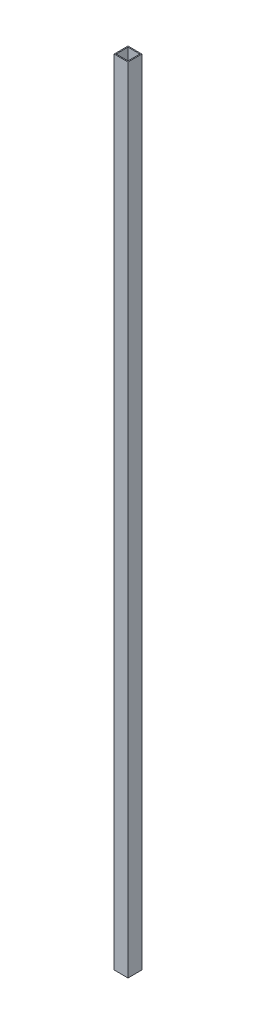
ISO-10303-21;
HEADER;
FILE_DESCRIPTION(('STEP AP214'),'2;1');
FILE_NAME('part.step','',(''),(''),'','','');
FILE_SCHEMA(('AUTOMOTIVE_DESIGN { 1 0 10303 214 1 1 1 1 }'));
ENDSEC;
DATA;
#1=APPLICATION_CONTEXT('core data for automotive mechanical design processes');
#2=APPLICATION_PROTOCOL_DEFINITION('international standard','automotive_design',2000,#1);
#3=PRODUCT_CONTEXT('',#1,'mechanical');
#4=PRODUCT('Part','Part','',(#3));
#5=PRODUCT_RELATED_PRODUCT_CATEGORY('part','',(#4));
#6=PRODUCT_DEFINITION_FORMATION('','',#4);
#7=PRODUCT_DEFINITION_CONTEXT('part definition',#1,'design');
#8=PRODUCT_DEFINITION('design','',#6,#7);
#9=PRODUCT_DEFINITION_SHAPE('','',#8);
#10=(LENGTH_UNIT() NAMED_UNIT(*) SI_UNIT(.MILLI.,.METRE.));
#11=(NAMED_UNIT(*) PLANE_ANGLE_UNIT() SI_UNIT($,.RADIAN.));
#12=(NAMED_UNIT(*) SI_UNIT($,.STERADIAN.) SOLID_ANGLE_UNIT());
#13=UNCERTAINTY_MEASURE_WITH_UNIT(LENGTH_MEASURE(1.E-05),#10,'distance_accuracy_value','');
#14=(GEOMETRIC_REPRESENTATION_CONTEXT(3) GLOBAL_UNCERTAINTY_ASSIGNED_CONTEXT((#13)) GLOBAL_UNIT_ASSIGNED_CONTEXT((#10,
#11,#12)) REPRESENTATION_CONTEXT('',''));
#15=CARTESIAN_POINT('',(0.,0.,0.));
#16=DIRECTION('',(0.,0.,1.));
#17=DIRECTION('',(1.,0.,0.));
#18=AXIS2_PLACEMENT_3D('',#15,#16,#17);
#19=CARTESIAN_POINT('',(0.,800.,0.));
#20=DIRECTION('',(0.,1.,0.));
#21=DIRECTION('',(0.,0.,1.));
#22=AXIS2_PLACEMENT_3D('',#19,#20,#21);
#23=PLANE('',#22);
#24=DIRECTION('',(-1.,0.,0.));
#25=VECTOR('',#24,1.);
#26=CARTESIAN_POINT('',(0.,800.,0.));
#27=LINE('',#26,#25);
#28=CARTESIAN_POINT('',(0.,800.,0.));
#29=VERTEX_POINT('',#28);
#30=CARTESIAN_POINT('',(-14.,800.,0.));
#31=VERTEX_POINT('',#30);
#32=EDGE_CURVE('E157',#29,#31,#27,.T.);
#33=ORIENTED_EDGE('',*,*,#32,.T.);
#34=DIRECTION('',(0.,0.,1.));
#35=VECTOR('',#34,1.);
#36=CARTESIAN_POINT('',(-14.,800.,0.));
#37=LINE('',#36,#35);
#38=CARTESIAN_POINT('',(-14.,800.,14.));
#39=VERTEX_POINT('',#38);
#40=EDGE_CURVE('E160',#31,#39,#37,.T.);
#41=ORIENTED_EDGE('',*,*,#40,.T.);
#42=DIRECTION('',(-1.,0.,0.));
#43=VECTOR('',#42,1.);
#44=CARTESIAN_POINT('',(0.,800.,14.));
#45=LINE('',#44,#43);
#46=CARTESIAN_POINT('',(0.,800.,14.));
#47=VERTEX_POINT('',#46);
#48=EDGE_CURVE('E163',#47,#39,#45,.T.);
#49=ORIENTED_EDGE('',*,*,#48,.F.);
#50=DIRECTION('',(0.,0.,1.));
#51=VECTOR('',#50,1.);
#52=CARTESIAN_POINT('',(0.,800.,0.));
#53=LINE('',#52,#51);
#54=EDGE_CURVE('E166',#29,#47,#53,.T.);
#55=ORIENTED_EDGE('',*,*,#54,.F.);
#56=EDGE_LOOP('',(#33,#41,#49,#55));
#57=FACE_BOUND('',#56,.T.);
#58=DIRECTION('',(0.,0.,1.));
#59=VECTOR('',#58,1.);
#60=CARTESIAN_POINT('',(-13.,800.,1.));
#61=LINE('',#60,#59);
#62=CARTESIAN_POINT('',(-13.,800.,1.));
#63=VERTEX_POINT('',#62);
#64=CARTESIAN_POINT('',(-13.,800.,13.));
#65=VERTEX_POINT('',#64);
#66=EDGE_CURVE('E131',#63,#65,#61,.T.);
#67=ORIENTED_EDGE('',*,*,#66,.F.);
#68=DIRECTION('',(-1.,0.,0.));
#69=VECTOR('',#68,1.);
#70=CARTESIAN_POINT('',(-1.,800.,1.));
#71=LINE('',#70,#69);
#72=CARTESIAN_POINT('',(-1.,800.,1.));
#73=VERTEX_POINT('',#72);
#74=EDGE_CURVE('E122',#73,#63,#71,.T.);
#75=ORIENTED_EDGE('',*,*,#74,.F.);
#76=DIRECTION('',(0.,0.,1.));
#77=VECTOR('',#76,1.);
#78=CARTESIAN_POINT('',(-1.,800.,1.));
#79=LINE('',#78,#77);
#80=CARTESIAN_POINT('',(-1.,800.,13.));
#81=VERTEX_POINT('',#80);
#82=EDGE_CURVE('E142',#73,#81,#79,.T.);
#83=ORIENTED_EDGE('',*,*,#82,.T.);
#84=DIRECTION('',(-1.,0.,0.));
#85=VECTOR('',#84,1.);
#86=CARTESIAN_POINT('',(-1.,800.,13.));
#87=LINE('',#86,#85);
#88=EDGE_CURVE('E72',#81,#65,#87,.T.);
#89=ORIENTED_EDGE('',*,*,#88,.T.);
#90=EDGE_LOOP('',(#67,#75,#83,#89));
#91=FACE_BOUND('',#90,.T.);
#92=ADVANCED_FACE('F57',(#57,#91),#23,.T.);
#93=CARTESIAN_POINT('',(0.,0.,0.));
#94=DIRECTION('',(0.,1.,0.));
#95=DIRECTION('',(0.,0.,1.));
#96=AXIS2_PLACEMENT_3D('',#93,#94,#95);
#97=PLANE('',#96);
#98=DIRECTION('',(-1.,0.,0.));
#99=VECTOR('',#98,1.);
#100=CARTESIAN_POINT('',(0.,0.,0.));
#101=LINE('',#100,#99);
#102=CARTESIAN_POINT('',(0.,0.,0.));
#103=VERTEX_POINT('',#102);
#104=CARTESIAN_POINT('',(-14.,0.,0.));
#105=VERTEX_POINT('',#104);
#106=EDGE_CURVE('E138',#103,#105,#101,.T.);
#107=ORIENTED_EDGE('',*,*,#106,.F.);
#108=DIRECTION('',(0.,0.,1.));
#109=VECTOR('',#108,1.);
#110=CARTESIAN_POINT('',(0.,0.,0.));
#111=LINE('',#110,#109);
#112=CARTESIAN_POINT('',(0.,0.,14.));
#113=VERTEX_POINT('',#112);
#114=EDGE_CURVE('E161',#103,#113,#111,.T.);
#115=ORIENTED_EDGE('',*,*,#114,.T.);
#116=DIRECTION('',(-1.,0.,0.));
#117=VECTOR('',#116,1.);
#118=CARTESIAN_POINT('',(0.,0.,14.));
#119=LINE('',#118,#117);
#120=CARTESIAN_POINT('',(-14.,0.,14.));
#121=VERTEX_POINT('',#120);
#122=EDGE_CURVE('E175',#113,#121,#119,.T.);
#123=ORIENTED_EDGE('',*,*,#122,.T.);
#124=DIRECTION('',(0.,0.,1.));
#125=VECTOR('',#124,1.);
#126=CARTESIAN_POINT('',(-14.,0.,0.));
#127=LINE('',#126,#125);
#128=EDGE_CURVE('E172',#105,#121,#127,.T.);
#129=ORIENTED_EDGE('',*,*,#128,.F.);
#130=EDGE_LOOP('',(#107,#115,#123,#129));
#131=FACE_BOUND('',#130,.T.);
#132=DIRECTION('',(-1.,0.,0.));
#133=VECTOR('',#132,1.);
#134=CARTESIAN_POINT('',(-1.,0.,1.));
#135=LINE('',#134,#133);
#136=CARTESIAN_POINT('',(-1.,0.,1.));
#137=VERTEX_POINT('',#136);
#138=CARTESIAN_POINT('',(-13.,0.,1.));
#139=VERTEX_POINT('',#138);
#140=EDGE_CURVE('E80',#137,#139,#135,.T.);
#141=ORIENTED_EDGE('',*,*,#140,.T.);
#142=DIRECTION('',(0.,0.,1.));
#143=VECTOR('',#142,1.);
#144=CARTESIAN_POINT('',(-13.,0.,1.));
#145=LINE('',#144,#143);
#146=CARTESIAN_POINT('',(-13.,0.,13.));
#147=VERTEX_POINT('',#146);
#148=EDGE_CURVE('E137',#139,#147,#145,.T.);
#149=ORIENTED_EDGE('',*,*,#148,.T.);
#150=DIRECTION('',(-1.,0.,0.));
#151=VECTOR('',#150,1.);
#152=CARTESIAN_POINT('',(-1.,0.,13.));
#153=LINE('',#152,#151);
#154=CARTESIAN_POINT('',(-1.,0.,13.));
#155=VERTEX_POINT('',#154);
#156=EDGE_CURVE('E148',#155,#147,#153,.T.);
#157=ORIENTED_EDGE('',*,*,#156,.F.);
#158=DIRECTION('',(0.,0.,1.));
#159=VECTOR('',#158,1.);
#160=CARTESIAN_POINT('',(-1.,0.,1.));
#161=LINE('',#160,#159);
#162=EDGE_CURVE('E132',#137,#155,#161,.T.);
#163=ORIENTED_EDGE('',*,*,#162,.F.);
#164=EDGE_LOOP('',(#141,#149,#157,#163));
#165=FACE_BOUND('',#164,.T.);
#166=ADVANCED_FACE('F192',(#131,#165),#97,.F.);
#167=CARTESIAN_POINT('',(0.,800.,0.));
#168=DIRECTION('',(0.,0.,1.));
#169=DIRECTION('',(1.,0.,0.));
#170=AXIS2_PLACEMENT_3D('',#167,#168,#169);
#171=PLANE('',#170);
#172=ORIENTED_EDGE('',*,*,#106,.T.);
#173=DIRECTION('',(0.,-1.,0.));
#174=VECTOR('',#173,1.);
#175=CARTESIAN_POINT('',(-14.,800.,0.));
#176=LINE('',#175,#174);
#177=EDGE_CURVE('E12',#31,#105,#176,.T.);
#178=ORIENTED_EDGE('',*,*,#177,.F.);
#179=ORIENTED_EDGE('',*,*,#32,.F.);
#180=DIRECTION('',(0.,-1.,0.));
#181=VECTOR('',#180,1.);
#182=CARTESIAN_POINT('',(0.,800.,0.));
#183=LINE('',#182,#181);
#184=EDGE_CURVE('E169',#29,#103,#183,.T.);
#185=ORIENTED_EDGE('',*,*,#184,.T.);
#186=EDGE_LOOP('',(#172,#178,#179,#185));
#187=FACE_BOUND('',#186,.T.);
#188=ADVANCED_FACE('F59',(#187),#171,.F.);
#189=CARTESIAN_POINT('',(-14.,800.,0.));
#190=DIRECTION('',(1.,0.,0.));
#191=DIRECTION('',(0.,0.,-1.));
#192=AXIS2_PLACEMENT_3D('',#189,#190,#191);
#193=PLANE('',#192);
#194=ORIENTED_EDGE('',*,*,#128,.T.);
#195=DIRECTION('',(0.,-1.,0.));
#196=VECTOR('',#195,1.);
#197=CARTESIAN_POINT('',(-14.,800.,14.));
#198=LINE('',#197,#196);
#199=EDGE_CURVE('E65',#39,#121,#198,.T.);
#200=ORIENTED_EDGE('',*,*,#199,.F.);
#201=ORIENTED_EDGE('',*,*,#40,.F.);
#202=ORIENTED_EDGE('',*,*,#177,.T.);
#203=EDGE_LOOP('',(#194,#200,#201,#202));
#204=FACE_BOUND('',#203,.T.);
#205=ADVANCED_FACE('F188',(#204),#193,.F.);
#206=CARTESIAN_POINT('',(0.,800.,14.));
#207=DIRECTION('',(0.,0.,1.));
#208=DIRECTION('',(1.,0.,0.));
#209=AXIS2_PLACEMENT_3D('',#206,#207,#208);
#210=PLANE('',#209);
#211=ORIENTED_EDGE('',*,*,#122,.F.);
#212=DIRECTION('',(0.,-1.,0.));
#213=VECTOR('',#212,1.);
#214=CARTESIAN_POINT('',(0.,800.,14.));
#215=LINE('',#214,#213);
#216=EDGE_CURVE('E181',#47,#113,#215,.T.);
#217=ORIENTED_EDGE('',*,*,#216,.F.);
#218=ORIENTED_EDGE('',*,*,#48,.T.);
#219=ORIENTED_EDGE('',*,*,#199,.T.);
#220=EDGE_LOOP('',(#211,#217,#218,#219));
#221=FACE_BOUND('',#220,.T.);
#222=ADVANCED_FACE('F185',(#221),#210,.T.);
#223=CARTESIAN_POINT('',(0.,800.,0.));
#224=DIRECTION('',(1.,0.,0.));
#225=DIRECTION('',(0.,0.,-1.));
#226=AXIS2_PLACEMENT_3D('',#223,#224,#225);
#227=PLANE('',#226);
#228=ORIENTED_EDGE('',*,*,#114,.F.);
#229=ORIENTED_EDGE('',*,*,#184,.F.);
#230=ORIENTED_EDGE('',*,*,#54,.T.);
#231=ORIENTED_EDGE('',*,*,#216,.T.);
#232=EDGE_LOOP('',(#228,#229,#230,#231));
#233=FACE_BOUND('',#232,.T.);
#234=ADVANCED_FACE('F196',(#233),#227,.T.);
#235=CARTESIAN_POINT('',(-1.,800.,1.));
#236=DIRECTION('',(0.,0.,1.));
#237=DIRECTION('',(1.,0.,0.));
#238=AXIS2_PLACEMENT_3D('',#235,#236,#237);
#239=PLANE('',#238);
#240=ORIENTED_EDGE('',*,*,#140,.F.);
#241=DIRECTION('',(0.,-1.,0.));
#242=VECTOR('',#241,1.);
#243=CARTESIAN_POINT('',(-1.,800.,1.));
#244=LINE('',#243,#242);
#245=EDGE_CURVE('E126',#73,#137,#244,.T.);
#246=ORIENTED_EDGE('',*,*,#245,.F.);
#247=ORIENTED_EDGE('',*,*,#74,.T.);
#248=DIRECTION('',(0.,-1.,0.));
#249=VECTOR('',#248,1.);
#250=CARTESIAN_POINT('',(-13.,800.,1.));
#251=LINE('',#250,#249);
#252=EDGE_CURVE('E125',#63,#139,#251,.T.);
#253=ORIENTED_EDGE('',*,*,#252,.T.);
#254=EDGE_LOOP('',(#240,#246,#247,#253));
#255=FACE_BOUND('',#254,.T.);
#256=ADVANCED_FACE('F124',(#255),#239,.T.);
#257=CARTESIAN_POINT('',(-13.,800.,1.));
#258=DIRECTION('',(1.,0.,0.));
#259=DIRECTION('',(0.,0.,-1.));
#260=AXIS2_PLACEMENT_3D('',#257,#258,#259);
#261=PLANE('',#260);
#262=ORIENTED_EDGE('',*,*,#148,.F.);
#263=ORIENTED_EDGE('',*,*,#252,.F.);
#264=ORIENTED_EDGE('',*,*,#66,.T.);
#265=DIRECTION('',(0.,-1.,0.));
#266=VECTOR('',#265,1.);
#267=CARTESIAN_POINT('',(-13.,800.,13.));
#268=LINE('',#267,#266);
#269=EDGE_CURVE('E139',#65,#147,#268,.T.);
#270=ORIENTED_EDGE('',*,*,#269,.T.);
#271=EDGE_LOOP('',(#262,#263,#264,#270));
#272=FACE_BOUND('',#271,.T.);
#273=ADVANCED_FACE('F135',(#272),#261,.T.);
#274=CARTESIAN_POINT('',(-1.,800.,13.));
#275=DIRECTION('',(0.,0.,1.));
#276=DIRECTION('',(1.,0.,0.));
#277=AXIS2_PLACEMENT_3D('',#274,#275,#276);
#278=PLANE('',#277);
#279=ORIENTED_EDGE('',*,*,#156,.T.);
#280=ORIENTED_EDGE('',*,*,#269,.F.);
#281=ORIENTED_EDGE('',*,*,#88,.F.);
#282=DIRECTION('',(0.,-1.,0.));
#283=VECTOR('',#282,1.);
#284=CARTESIAN_POINT('',(-1.,800.,13.));
#285=LINE('',#284,#283);
#286=EDGE_CURVE('E154',#81,#155,#285,.T.);
#287=ORIENTED_EDGE('',*,*,#286,.T.);
#288=EDGE_LOOP('',(#279,#280,#281,#287));
#289=FACE_BOUND('',#288,.T.);
#290=ADVANCED_FACE('F236',(#289),#278,.F.);
#291=CARTESIAN_POINT('',(-1.,800.,1.));
#292=DIRECTION('',(1.,0.,0.));
#293=DIRECTION('',(0.,0.,-1.));
#294=AXIS2_PLACEMENT_3D('',#291,#292,#293);
#295=PLANE('',#294);
#296=ORIENTED_EDGE('',*,*,#162,.T.);
#297=ORIENTED_EDGE('',*,*,#286,.F.);
#298=ORIENTED_EDGE('',*,*,#82,.F.);
#299=ORIENTED_EDGE('',*,*,#245,.T.);
#300=EDGE_LOOP('',(#296,#297,#298,#299));
#301=FACE_BOUND('',#300,.T.);
#302=ADVANCED_FACE('F242',(#301),#295,.F.);
#303=CLOSED_SHELL('',(#92,#166,#188,#205,#222,#234,#256,#273,#290,#302));
#304=MANIFOLD_SOLID_BREP('B2',#303);
#305=ADVANCED_BREP_SHAPE_REPRESENTATION('',(#18,#304),#14);
#306=SHAPE_DEFINITION_REPRESENTATION(#9,#305);
ENDSEC;
END-ISO-10303-21;
